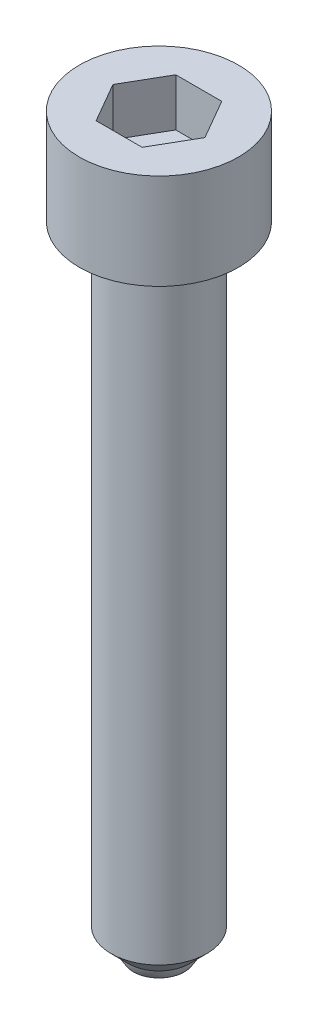
ISO-10303-21;
HEADER;
FILE_DESCRIPTION(('STEP AP214'),'2;1');
FILE_NAME('part.step','',(''),(''),'','','');
FILE_SCHEMA(('AUTOMOTIVE_DESIGN { 1 0 10303 214 1 1 1 1 }'));
ENDSEC;
DATA;
#1=APPLICATION_CONTEXT('core data for automotive mechanical design processes');
#2=APPLICATION_PROTOCOL_DEFINITION('international standard','automotive_design',2000,#1);
#3=PRODUCT_CONTEXT('',#1,'mechanical');
#4=PRODUCT('Part','Part','',(#3));
#5=PRODUCT_RELATED_PRODUCT_CATEGORY('part','',(#4));
#6=PRODUCT_DEFINITION_FORMATION('','',#4);
#7=PRODUCT_DEFINITION_CONTEXT('part definition',#1,'design');
#8=PRODUCT_DEFINITION('design','',#6,#7);
#9=PRODUCT_DEFINITION_SHAPE('','',#8);
#10=(LENGTH_UNIT() NAMED_UNIT(*) SI_UNIT(.MILLI.,.METRE.));
#11=(NAMED_UNIT(*) PLANE_ANGLE_UNIT() SI_UNIT($,.RADIAN.));
#12=(NAMED_UNIT(*) SI_UNIT($,.STERADIAN.) SOLID_ANGLE_UNIT());
#13=UNCERTAINTY_MEASURE_WITH_UNIT(LENGTH_MEASURE(1.E-05),#10,'distance_accuracy_value','');
#14=(GEOMETRIC_REPRESENTATION_CONTEXT(3) GLOBAL_UNCERTAINTY_ASSIGNED_CONTEXT((#13)) GLOBAL_UNIT_ASSIGNED_CONTEXT((#10,
#11,#12)) REPRESENTATION_CONTEXT('',''));
#15=CARTESIAN_POINT('',(0.,0.,0.));
#16=DIRECTION('',(0.,0.,1.));
#17=DIRECTION('',(1.,0.,0.));
#18=AXIS2_PLACEMENT_3D('',#15,#16,#17);
#19=CARTESIAN_POINT('',(0.,-40.,0.));
#20=DIRECTION('',(0.,1.,0.));
#21=DIRECTION('',(0.,0.,1.));
#22=AXIS2_PLACEMENT_3D('',#19,#20,#21);
#23=PLANE('',#22);
#24=CARTESIAN_POINT('',(0.,-40.,0.));
#25=DIRECTION('',(0.,1.,0.));
#26=DIRECTION('',(0.,0.,1.));
#27=AXIS2_PLACEMENT_3D('',#24,#25,#26);
#28=CIRCLE('',#27,1.60000000000001);
#29=CARTESIAN_POINT('',(1.60000000000001,-40.,0.));
#30=VERTEX_POINT('',#29);
#31=EDGE_CURVE('E11',#30,#30,#28,.T.);
#32=ORIENTED_EDGE('',*,*,#31,.F.);
#33=EDGE_LOOP('',(#32));
#34=FACE_BOUND('',#33,.T.);
#35=ADVANCED_FACE('F35',(#34),#23,.F.);
#36=CARTESIAN_POINT('',(0.,-38.8,0.));
#37=DIRECTION('',(0.,1.,0.));
#38=DIRECTION('',(1.,0.,0.));
#39=AXIS2_PLACEMENT_3D('',#36,#37,#38);
#40=SPHERICAL_SURFACE('',#39,2.);
#41=CARTESIAN_POINT('',(0.,-39.4,0.));
#42=DIRECTION('',(0.,1.,0.));
#43=DIRECTION('',(0.,0.,1.));
#44=AXIS2_PLACEMENT_3D('',#41,#42,#43);
#45=CIRCLE('',#44,1.9078784028339);
#46=CARTESIAN_POINT('',(1.9078784028339,-39.4,0.));
#47=VERTEX_POINT('',#46);
#48=EDGE_CURVE('E42',#47,#47,#45,.T.);
#49=CARTESIAN_POINT('',(1.9078784028339,-39.4,0.));
#50=CARTESIAN_POINT('',(1.90576085142183,-39.4067333893573,0.));
#51=CARTESIAN_POINT('',(1.90360765143272,-39.4134555677269,0.));
#52=CARTESIAN_POINT('',(1.89923020195501,-39.4268767509851,0.));
#53=CARTESIAN_POINT('',(1.89700595246641,-39.4335757558738,0.));
#54=CARTESIAN_POINT('',(1.89248665164431,-39.4469498406647,0.));
#55=CARTESIAN_POINT('',(1.8901916003108,-39.453624920567,0.));
#56=CARTESIAN_POINT('',(1.88553095352445,-39.4669504072579,0.));
#57=CARTESIAN_POINT('',(1.88316535807161,-39.4736008140465,0.));
#58=CARTESIAN_POINT('',(1.87836388810829,-39.4868762089618,0.));
#59=CARTESIAN_POINT('',(1.87592801359782,-39.4935011970886,0.));
#60=CARTESIAN_POINT('',(1.87098625861242,-39.5067250120317,0.));
#61=CARTESIAN_POINT('',(1.86848037813751,-39.5133238388481,0.));
#62=CARTESIAN_POINT('',(1.86339889212301,-39.526494591441,0.));
#63=CARTESIAN_POINT('',(1.86082328658344,-39.5330665172175,0.));
#64=CARTESIAN_POINT('',(1.85560263916657,-39.5461827310207,0.));
#65=CARTESIAN_POINT('',(1.85295759728928,-39.5527270190473,0.));
#66=CARTESIAN_POINT('',(1.84759837370477,-39.5657872237376,0.));
#67=CARTESIAN_POINT('',(1.84488419199755,-39.5723031404012,0.));
#68=CARTESIAN_POINT('',(1.83938699301232,-39.5853058719334,0.));
#69=CARTESIAN_POINT('',(1.83660397573431,-39.5917926868019,0.));
#70=CARTESIAN_POINT('',(1.83096941758285,-39.6047364875736,0.));
#71=CARTESIAN_POINT('',(1.82811787670941,-39.6111934734769,0.));
#72=CARTESIAN_POINT('',(1.822346591024,-39.624076892492,0.));
#73=CARTESIAN_POINT('',(1.81942684621203,-39.6305033256038,0.));
#74=CARTESIAN_POINT('',(1.81351947995209,-39.6433249186348,0.));
#75=CARTESIAN_POINT('',(1.81053185850412,-39.6497200785539,0.));
#76=CARTESIAN_POINT('',(1.80448907388365,-39.662478408304,0.));
#77=CARTESIAN_POINT('',(1.80143391071115,-39.6688415781349,0.));
#78=CARTESIAN_POINT('',(1.79525638512453,-39.6815352143991,0.));
#79=CARTESIAN_POINT('',(1.7921340227104,-39.6878656808323,0.));
#80=CARTESIAN_POINT('',(1.7858224486564,-39.7004932006578,0.));
#81=CARTESIAN_POINT('',(1.78263323701653,-39.70679025405,0.));
#82=CARTESIAN_POINT('',(1.77618832202075,-39.7193502418954,0.));
#83=CARTESIAN_POINT('',(1.77293261866483,-39.7256131763487,0.));
#84=CARTESIAN_POINT('',(1.76635508520032,-39.7381042242432,0.));
#85=CARTESIAN_POINT('',(1.76303325509173,-39.7443323376845,0.));
#86=CARTESIAN_POINT('',(1.75632384049804,-39.7567530453854,0.));
#87=CARTESIAN_POINT('',(1.75293625601295,-39.762945639645,0.));
#88=CARTESIAN_POINT('',(1.74609571241348,-39.7752946147946,0.));
#89=CARTESIAN_POINT('',(1.7426427532991,-39.7814509956845,0.));
#90=CARTESIAN_POINT('',(1.73567184751676,-39.7937268539663,0.));
#91=CARTESIAN_POINT('',(1.73215390084879,-39.7998463313581,0.));
#92=CARTESIAN_POINT('',(1.72505341432005,-39.8120476966521,0.));
#93=CARTESIAN_POINT('',(1.72147087445927,-39.8181295845542,0.));
#94=CARTESIAN_POINT('',(1.71424160314656,-39.8302550890908,0.));
#95=CARTESIAN_POINT('',(1.71059487169462,-39.8362987057253,0.));
#96=CARTESIAN_POINT('',(1.70323762599714,-39.8483469902392,0.));
#97=CARTESIAN_POINT('',(1.6995271117516,-39.8543516581186,0.));
#98=CARTESIAN_POINT('',(1.69204271641431,-39.8663213720006,0.));
#99=CARTESIAN_POINT('',(1.68826883532256,-39.8722864180031,0.));
#100=CARTESIAN_POINT('',(1.68065812934435,-39.8841762194521,0.));
#101=CARTESIAN_POINT('',(1.67682130445788,-39.8901009748984,0.));
#102=CARTESIAN_POINT('',(1.66908514099519,-39.90190953107,0.));
#103=CARTESIAN_POINT('',(1.66518580241897,-39.9077933317952,0.));
#104=CARTESIAN_POINT('',(1.65732504869882,-39.9195193189578,0.));
#105=CARTESIAN_POINT('',(1.65336363355489,-39.9253615053951,0.));
#106=CARTESIAN_POINT('',(1.64537917074534,-39.9370036090543,0.));
#107=CARTESIAN_POINT('',(1.64135612307971,-39.9428035262761,0.));
#108=CARTESIAN_POINT('',(1.6332488463117,-39.9543604414104,0.));
#109=CARTESIAN_POINT('',(1.62916461720932,-39.9601174393229,0.));
#110=CARTESIAN_POINT('',(1.62093543502618,-39.9715878702003,0.));
#111=CARTESIAN_POINT('',(1.61679048194542,-39.9773013031652,0.));
#112=CARTESIAN_POINT('',(1.60844031788101,-39.9886839647203,0.));
#113=CARTESIAN_POINT('',(1.60423510689736,-39.9943531933105,0.));
#114=CARTESIAN_POINT('',(1.60000000000001,-40.,0.));
#115=B_SPLINE_CURVE_WITH_KNOTS('',3,(#49,#50,#51,#52,#53,#54,#55,#56,#57,#58,#59,#60,#61,#62,
#63,#64,#65,#66,#67,#68,#69,#70,#71,#72,#73,#74,#75,#76,#77,#78,#79,#80,#81,#82,#83,#84,#85,#86,
#87,#88,#89,#90,#91,#92,#93,#94,#95,#96,#97,#98,#99,#100,#101,#102,#103,#104,#105,#106,#107,
#108,#109,#110,#111,#112,#113,#114),.UNSPECIFIED.,.F.,.F.,(4,2,2,2,2,2,2,2,2,2,2,2,2,2,2,2,2,2,
2,2,2,2,2,2,2,2,2,2,2,2,2,2,4),(0.,0.0211754295157301,0.0423508590314632,0.0635262885471903,
0.0847017180629186,0.105877147578651,0.127052577094381,0.14822800661011,0.169403436125839,
0.19057886564157,0.2117542951573,0.232929724673031,0.254105154188756,0.275280583704489,
0.296456013220215,0.317631442735948,0.338806872251677,0.359982301767408,0.381157731283133,
0.402333160798863,0.423508590314595,0.444684019830324,0.465859449346052,0.487034878861781,
0.508210308377513,0.529385737893243,0.550561167408973,0.571736596924702,0.592912026440433,
0.614087455956158,0.63526288547189,0.656438314987622,0.677613744503347),.UNSPECIFIED.);
#116=EDGE_CURVE('BSEAM157',#47,#30,#115,.T.);
#117=ORIENTED_EDGE('',*,*,#48,.F.);
#118=ORIENTED_EDGE('',*,*,#31,.T.);
#119=ORIENTED_EDGE('',*,*,#116,.T.);
#120=ORIENTED_EDGE('',*,*,#116,.F.);
#121=EDGE_LOOP('',(#117,#119,#118,#120));
#122=FACE_BOUND('',#121,.T.);
#123=ADVANCED_FACE('F157',(#122),#40,.T.);
#124=CARTESIAN_POINT('',(0.,-39.4,0.));
#125=DIRECTION('',(0.,1.,0.));
#126=DIRECTION('',(0.,0.,1.));
#127=AXIS2_PLACEMENT_3D('',#124,#125,#126);
#128=CONICAL_SURFACE('',#127,1.9078784028339,0.78539816339745);
#129=CARTESIAN_POINT('',(0.,-38.3078784028339,0.));
#130=DIRECTION('',(0.,1.,0.));
#131=DIRECTION('',(0.,0.,1.));
#132=AXIS2_PLACEMENT_3D('',#129,#130,#131);
#133=CIRCLE('',#132,3.00000000000001);
#134=CARTESIAN_POINT('',(0.,-38.3078784028339,3.00000000000001));
#135=VERTEX_POINT('',#134);
#136=EDGE_CURVE('E150',#135,#135,#133,.T.);
#137=ORIENTED_EDGE('',*,*,#136,.F.);
#138=EDGE_LOOP('',(#137));
#139=FACE_BOUND('',#138,.T.);
#140=ORIENTED_EDGE('',*,*,#48,.T.);
#141=EDGE_LOOP('',(#140));
#142=FACE_BOUND('',#141,.T.);
#143=ADVANCED_FACE('F155',(#139,#142),#128,.T.);
#144=CARTESIAN_POINT('',(0.,61.6916426261037,0.));
#145=DIRECTION('',(0.,1.,0.));
#146=DIRECTION('',(0.,0.,1.));
#147=AXIS2_PLACEMENT_3D('',#144,#145,#146);
#148=CYLINDRICAL_SURFACE('',#147,3.00000000000001);
#149=CARTESIAN_POINT('',(0.,0.,0.));
#150=DIRECTION('',(0.,1.,0.));
#151=DIRECTION('',(0.,0.,1.));
#152=AXIS2_PLACEMENT_3D('',#149,#150,#151);
#153=CIRCLE('',#152,3.00000000000001);
#154=CARTESIAN_POINT('',(0.,0.,3.00000000000001));
#155=VERTEX_POINT('',#154);
#156=EDGE_CURVE('E147',#155,#155,#153,.T.);
#157=ORIENTED_EDGE('',*,*,#156,.F.);
#158=EDGE_LOOP('',(#157));
#159=FACE_BOUND('',#158,.T.);
#160=ORIENTED_EDGE('',*,*,#136,.T.);
#161=EDGE_LOOP('',(#160));
#162=FACE_BOUND('',#161,.T.);
#163=ADVANCED_FACE('F175',(#159,#162),#148,.T.);
#164=CARTESIAN_POINT('',(3.00000000000001,0.,0.));
#165=DIRECTION('',(0.,1.,0.));
#166=DIRECTION('',(0.,0.,1.));
#167=AXIS2_PLACEMENT_3D('',#164,#165,#166);
#168=PLANE('',#167);
#169=CARTESIAN_POINT('',(0.,0.,0.));
#170=DIRECTION('',(0.,1.,0.));
#171=DIRECTION('',(0.,0.,1.));
#172=AXIS2_PLACEMENT_3D('',#169,#170,#171);
#173=CIRCLE('',#172,5.00000000000001);
#174=CARTESIAN_POINT('',(0.,0.,5.00000000000001));
#175=VERTEX_POINT('',#174);
#176=EDGE_CURVE('E144',#175,#175,#173,.T.);
#177=ORIENTED_EDGE('',*,*,#176,.F.);
#178=EDGE_LOOP('',(#177));
#179=FACE_BOUND('',#178,.T.);
#180=ORIENTED_EDGE('',*,*,#156,.T.);
#181=EDGE_LOOP('',(#180));
#182=FACE_BOUND('',#181,.T.);
#183=ADVANCED_FACE('F183',(#179,#182),#168,.F.);
#184=CARTESIAN_POINT('',(0.,61.6916426261037,0.));
#185=DIRECTION('',(0.,1.,0.));
#186=DIRECTION('',(0.,0.,1.));
#187=AXIS2_PLACEMENT_3D('',#184,#185,#186);
#188=CYLINDRICAL_SURFACE('',#187,5.00000000000001);
#189=CARTESIAN_POINT('',(0.,6.,0.));
#190=DIRECTION('',(0.,1.,0.));
#191=DIRECTION('',(0.,0.,1.));
#192=AXIS2_PLACEMENT_3D('',#189,#190,#191);
#193=CIRCLE('',#192,5.00000000000001);
#194=CARTESIAN_POINT('',(0.,6.,5.00000000000001));
#195=VERTEX_POINT('',#194);
#196=EDGE_CURVE('E136',#195,#195,#193,.T.);
#197=ORIENTED_EDGE('',*,*,#196,.F.);
#198=EDGE_LOOP('',(#197));
#199=FACE_BOUND('',#198,.T.);
#200=ORIENTED_EDGE('',*,*,#176,.T.);
#201=EDGE_LOOP('',(#200));
#202=FACE_BOUND('',#201,.T.);
#203=ADVANCED_FACE('F191',(#199,#202),#188,.T.);
#204=CARTESIAN_POINT('',(5.00000000000001,6.,0.));
#205=DIRECTION('',(0.,-1.,0.));
#206=DIRECTION('',(0.,0.,-1.));
#207=AXIS2_PLACEMENT_3D('',#204,#205,#206);
#208=PLANE('',#207);
#209=DIRECTION('',(-1.,0.,0.));
#210=VECTOR('',#209,1.);
#211=CARTESIAN_POINT('',(1.44337567297406,6.,-2.5));
#212=LINE('',#211,#210);
#213=CARTESIAN_POINT('',(1.44337567297406,6.,-2.5));
#214=VERTEX_POINT('',#213);
#215=CARTESIAN_POINT('',(-1.44337567297406,6.,-2.5));
#216=VERTEX_POINT('',#215);
#217=EDGE_CURVE('E123',#214,#216,#212,.T.);
#218=ORIENTED_EDGE('',*,*,#217,.F.);
#219=DIRECTION('',(-0.5,0.,-0.866025403784439));
#220=VECTOR('',#219,1.);
#221=CARTESIAN_POINT('',(2.88675134594813,6.,0.));
#222=LINE('',#221,#220);
#223=CARTESIAN_POINT('',(2.88675134594813,6.,0.));
#224=VERTEX_POINT('',#223);
#225=EDGE_CURVE('E49',#224,#214,#222,.T.);
#226=ORIENTED_EDGE('',*,*,#225,.F.);
#227=DIRECTION('',(0.5,0.,-0.866025403784439));
#228=VECTOR('',#227,1.);
#229=CARTESIAN_POINT('',(1.44337567297407,6.,2.5));
#230=LINE('',#229,#228);
#231=CARTESIAN_POINT('',(1.44337567297407,6.,2.5));
#232=VERTEX_POINT('',#231);
#233=EDGE_CURVE('E132',#232,#224,#230,.T.);
#234=ORIENTED_EDGE('',*,*,#233,.F.);
#235=DIRECTION('',(1.,0.,0.));
#236=VECTOR('',#235,1.);
#237=CARTESIAN_POINT('',(-1.44337567297406,6.,2.5));
#238=LINE('',#237,#236);
#239=CARTESIAN_POINT('',(-1.44337567297406,6.,2.5));
#240=VERTEX_POINT('',#239);
#241=EDGE_CURVE('E130',#240,#232,#238,.T.);
#242=ORIENTED_EDGE('',*,*,#241,.F.);
#243=DIRECTION('',(0.5,0.,0.866025403784439));
#244=VECTOR('',#243,1.);
#245=CARTESIAN_POINT('',(-2.88675134594813,6.,0.));
#246=LINE('',#245,#244);
#247=CARTESIAN_POINT('',(-2.88675134594813,6.,0.));
#248=VERTEX_POINT('',#247);
#249=EDGE_CURVE('E97',#248,#240,#246,.T.);
#250=ORIENTED_EDGE('',*,*,#249,.F.);
#251=DIRECTION('',(-0.5,0.,0.866025403784439));
#252=VECTOR('',#251,1.);
#253=CARTESIAN_POINT('',(-1.44337567297406,6.,-2.5));
#254=LINE('',#253,#252);
#255=EDGE_CURVE('E126',#216,#248,#254,.T.);
#256=ORIENTED_EDGE('',*,*,#255,.F.);
#257=EDGE_LOOP('',(#218,#226,#234,#242,#250,#256));
#258=FACE_BOUND('',#257,.T.);
#259=ORIENTED_EDGE('',*,*,#196,.T.);
#260=EDGE_LOOP('',(#259));
#261=FACE_BOUND('',#260,.T.);
#262=ADVANCED_FACE('F199',(#258,#261),#208,.F.);
#263=CARTESIAN_POINT('',(2.88675134594813,3.,0.));
#264=DIRECTION('',(0.866025403784438,0.,-0.5));
#265=DIRECTION('',(-0.5,0.,-0.866025403784439));
#266=AXIS2_PLACEMENT_3D('',#263,#264,#265);
#267=PLANE('',#266);
#268=ORIENTED_EDGE('',*,*,#225,.T.);
#269=DIRECTION('',(0.,1.,0.));
#270=VECTOR('',#269,1.);
#271=CARTESIAN_POINT('',(1.44337567297406,3.,-2.5));
#272=LINE('',#271,#270);
#273=CARTESIAN_POINT('',(1.44337567297406,3.,-2.5));
#274=VERTEX_POINT('',#273);
#275=EDGE_CURVE('E79',#274,#214,#272,.T.);
#276=ORIENTED_EDGE('',*,*,#275,.F.);
#277=DIRECTION('',(-0.5,0.,-0.866025403784439));
#278=VECTOR('',#277,1.);
#279=CARTESIAN_POINT('',(2.88675134594813,3.,0.));
#280=LINE('',#279,#278);
#281=CARTESIAN_POINT('',(2.88675134594813,3.,0.));
#282=VERTEX_POINT('',#281);
#283=EDGE_CURVE('E134',#282,#274,#280,.T.);
#284=ORIENTED_EDGE('',*,*,#283,.F.);
#285=DIRECTION('',(0.,1.,0.));
#286=VECTOR('',#285,1.);
#287=CARTESIAN_POINT('',(2.88675134594813,3.,0.));
#288=LINE('',#287,#286);
#289=EDGE_CURVE('E57',#282,#224,#288,.T.);
#290=ORIENTED_EDGE('',*,*,#289,.T.);
#291=EDGE_LOOP('',(#268,#276,#284,#290));
#292=FACE_BOUND('',#291,.T.);
#293=ADVANCED_FACE('F207',(#292),#267,.F.);
#294=CARTESIAN_POINT('',(1.44337567297407,3.,2.5));
#295=DIRECTION('',(0.866025403784438,0.,0.5));
#296=DIRECTION('',(0.5,0.,-0.866025403784439));
#297=AXIS2_PLACEMENT_3D('',#294,#295,#296);
#298=PLANE('',#297);
#299=ORIENTED_EDGE('',*,*,#233,.T.);
#300=ORIENTED_EDGE('',*,*,#289,.F.);
#301=DIRECTION('',(0.5,0.,-0.866025403784439));
#302=VECTOR('',#301,1.);
#303=CARTESIAN_POINT('',(1.44337567297407,3.,2.5));
#304=LINE('',#303,#302);
#305=CARTESIAN_POINT('',(1.44337567297407,3.,2.5));
#306=VERTEX_POINT('',#305);
#307=EDGE_CURVE('E109',#306,#282,#304,.T.);
#308=ORIENTED_EDGE('',*,*,#307,.F.);
#309=DIRECTION('',(0.,1.,0.));
#310=VECTOR('',#309,1.);
#311=CARTESIAN_POINT('',(1.44337567297407,3.,2.5));
#312=LINE('',#311,#310);
#313=EDGE_CURVE('E101',#306,#232,#312,.T.);
#314=ORIENTED_EDGE('',*,*,#313,.T.);
#315=EDGE_LOOP('',(#299,#300,#308,#314));
#316=FACE_BOUND('',#315,.T.);
#317=ADVANCED_FACE('F215',(#316),#298,.F.);
#318=CARTESIAN_POINT('',(-1.44337567297406,3.,2.5));
#319=DIRECTION('',(0.,0.,1.));
#320=DIRECTION('',(1.,0.,0.));
#321=AXIS2_PLACEMENT_3D('',#318,#319,#320);
#322=PLANE('',#321);
#323=ORIENTED_EDGE('',*,*,#241,.T.);
#324=ORIENTED_EDGE('',*,*,#313,.F.);
#325=DIRECTION('',(1.,0.,0.));
#326=VECTOR('',#325,1.);
#327=CARTESIAN_POINT('',(-1.44337567297406,3.,2.5));
#328=LINE('',#327,#326);
#329=CARTESIAN_POINT('',(-1.44337567297406,3.,2.5));
#330=VERTEX_POINT('',#329);
#331=EDGE_CURVE('E105',#330,#306,#328,.T.);
#332=ORIENTED_EDGE('',*,*,#331,.F.);
#333=DIRECTION('',(0.,1.,0.));
#334=VECTOR('',#333,1.);
#335=CARTESIAN_POINT('',(-1.44337567297406,3.,2.5));
#336=LINE('',#335,#334);
#337=EDGE_CURVE('E90',#330,#240,#336,.T.);
#338=ORIENTED_EDGE('',*,*,#337,.T.);
#339=EDGE_LOOP('',(#323,#324,#332,#338));
#340=FACE_BOUND('',#339,.T.);
#341=ADVANCED_FACE('F106',(#340),#322,.F.);
#342=CARTESIAN_POINT('',(-2.88675134594813,3.,0.));
#343=DIRECTION('',(-0.866025403784438,0.,0.5));
#344=DIRECTION('',(0.5,0.,0.866025403784439));
#345=AXIS2_PLACEMENT_3D('',#342,#343,#344);
#346=PLANE('',#345);
#347=ORIENTED_EDGE('',*,*,#249,.T.);
#348=ORIENTED_EDGE('',*,*,#337,.F.);
#349=DIRECTION('',(0.5,0.,0.866025403784439));
#350=VECTOR('',#349,1.);
#351=CARTESIAN_POINT('',(-2.88675134594813,3.,0.));
#352=LINE('',#351,#350);
#353=CARTESIAN_POINT('',(-2.88675134594813,3.,0.));
#354=VERTEX_POINT('',#353);
#355=EDGE_CURVE('E94',#354,#330,#352,.T.);
#356=ORIENTED_EDGE('',*,*,#355,.F.);
#357=DIRECTION('',(0.,1.,0.));
#358=VECTOR('',#357,1.);
#359=CARTESIAN_POINT('',(-2.88675134594813,3.,0.));
#360=LINE('',#359,#358);
#361=EDGE_CURVE('E102',#354,#248,#360,.T.);
#362=ORIENTED_EDGE('',*,*,#361,.T.);
#363=EDGE_LOOP('',(#347,#348,#356,#362));
#364=FACE_BOUND('',#363,.T.);
#365=ADVANCED_FACE('F92',(#364),#346,.F.);
#366=CARTESIAN_POINT('',(-1.44337567297406,3.,-2.5));
#367=DIRECTION('',(-0.866025403784439,0.,-0.5));
#368=DIRECTION('',(-0.5,0.,0.866025403784439));
#369=AXIS2_PLACEMENT_3D('',#366,#367,#368);
#370=PLANE('',#369);
#371=ORIENTED_EDGE('',*,*,#255,.T.);
#372=ORIENTED_EDGE('',*,*,#361,.F.);
#373=DIRECTION('',(-0.5,0.,0.866025403784439));
#374=VECTOR('',#373,1.);
#375=CARTESIAN_POINT('',(-1.44337567297406,3.,-2.5));
#376=LINE('',#375,#374);
#377=CARTESIAN_POINT('',(-1.44337567297406,3.,-2.5));
#378=VERTEX_POINT('',#377);
#379=EDGE_CURVE('E115',#378,#354,#376,.T.);
#380=ORIENTED_EDGE('',*,*,#379,.F.);
#381=DIRECTION('',(0.,1.,0.));
#382=VECTOR('',#381,1.);
#383=CARTESIAN_POINT('',(-1.44337567297406,3.,-2.5));
#384=LINE('',#383,#382);
#385=EDGE_CURVE('E139',#378,#216,#384,.T.);
#386=ORIENTED_EDGE('',*,*,#385,.T.);
#387=EDGE_LOOP('',(#371,#372,#380,#386));
#388=FACE_BOUND('',#387,.T.);
#389=ADVANCED_FACE('F234',(#388),#370,.F.);
#390=CARTESIAN_POINT('',(1.44337567297406,3.,-2.5));
#391=DIRECTION('',(0.,0.,-1.));
#392=DIRECTION('',(-1.,0.,0.));
#393=AXIS2_PLACEMENT_3D('',#390,#391,#392);
#394=PLANE('',#393);
#395=ORIENTED_EDGE('',*,*,#217,.T.);
#396=ORIENTED_EDGE('',*,*,#385,.F.);
#397=DIRECTION('',(-1.,0.,0.));
#398=VECTOR('',#397,1.);
#399=CARTESIAN_POINT('',(1.44337567297406,3.,-2.5));
#400=LINE('',#399,#398);
#401=EDGE_CURVE('E117',#274,#378,#400,.T.);
#402=ORIENTED_EDGE('',*,*,#401,.F.);
#403=ORIENTED_EDGE('',*,*,#275,.T.);
#404=EDGE_LOOP('',(#395,#396,#402,#403));
#405=FACE_BOUND('',#404,.T.);
#406=ADVANCED_FACE('F241',(#405),#394,.F.);
#407=CARTESIAN_POINT('',(2.88675134594813,3.,0.));
#408=DIRECTION('',(0.,-1.,0.));
#409=DIRECTION('',(0.,0.,-1.));
#410=AXIS2_PLACEMENT_3D('',#407,#408,#409);
#411=PLANE('',#410);
#412=ORIENTED_EDGE('',*,*,#283,.T.);
#413=ORIENTED_EDGE('',*,*,#401,.T.);
#414=ORIENTED_EDGE('',*,*,#379,.T.);
#415=ORIENTED_EDGE('',*,*,#355,.T.);
#416=ORIENTED_EDGE('',*,*,#331,.T.);
#417=ORIENTED_EDGE('',*,*,#307,.T.);
#418=EDGE_LOOP('',(#412,#413,#414,#415,#416,#417));
#419=FACE_BOUND('',#418,.T.);
#420=ADVANCED_FACE('F112',(#419),#411,.F.);
#421=CLOSED_SHELL('',(#35,#123,#143,#163,#183,#203,#262,#293,#317,#341,#365,#389,#406,#420));
#422=MANIFOLD_SOLID_BREP('B2',#421);
#423=ADVANCED_BREP_SHAPE_REPRESENTATION('',(#18,#422),#14);
#424=SHAPE_DEFINITION_REPRESENTATION(#9,#423);
ENDSEC;
END-ISO-10303-21;
